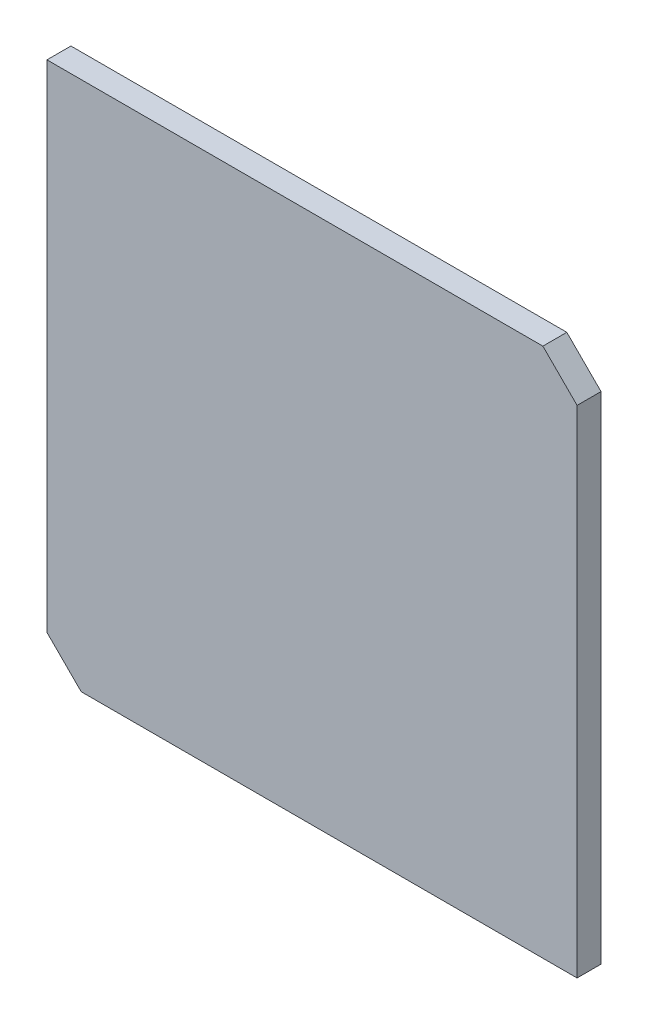
ISO-10303-21;
HEADER;
FILE_DESCRIPTION(('STEP AP214'),'2;1');
FILE_NAME('part.step','',(''),(''),'','','');
FILE_SCHEMA(('AUTOMOTIVE_DESIGN { 1 0 10303 214 1 1 1 1 }'));
ENDSEC;
DATA;
#1=APPLICATION_CONTEXT('core data for automotive mechanical design processes');
#2=APPLICATION_PROTOCOL_DEFINITION('international standard','automotive_design',2000,#1);
#3=PRODUCT_CONTEXT('',#1,'mechanical');
#4=PRODUCT('Part','Part','',(#3));
#5=PRODUCT_RELATED_PRODUCT_CATEGORY('part','',(#4));
#6=PRODUCT_DEFINITION_FORMATION('','',#4);
#7=PRODUCT_DEFINITION_CONTEXT('part definition',#1,'design');
#8=PRODUCT_DEFINITION('design','',#6,#7);
#9=PRODUCT_DEFINITION_SHAPE('','',#8);
#10=(LENGTH_UNIT() NAMED_UNIT(*) SI_UNIT(.MILLI.,.METRE.));
#11=(NAMED_UNIT(*) PLANE_ANGLE_UNIT() SI_UNIT($,.RADIAN.));
#12=(NAMED_UNIT(*) SI_UNIT($,.STERADIAN.) SOLID_ANGLE_UNIT());
#13=UNCERTAINTY_MEASURE_WITH_UNIT(LENGTH_MEASURE(1.E-05),#10,'distance_accuracy_value','');
#14=(GEOMETRIC_REPRESENTATION_CONTEXT(3) GLOBAL_UNCERTAINTY_ASSIGNED_CONTEXT((#13)) GLOBAL_UNIT_ASSIGNED_CONTEXT((#10,
#11,#12)) REPRESENTATION_CONTEXT('',''));
#15=CARTESIAN_POINT('',(0.,0.,0.));
#16=DIRECTION('',(0.,0.,1.));
#17=DIRECTION('',(1.,0.,0.));
#18=AXIS2_PLACEMENT_3D('',#15,#16,#17);
#19=CARTESIAN_POINT('',(-155.,155.,14.));
#20=DIRECTION('',(1.,0.,0.));
#21=DIRECTION('',(0.,1.,0.));
#22=AXIS2_PLACEMENT_3D('',#19,#20,#21);
#23=PLANE('',#22);
#24=DIRECTION('',(0.,-1.,0.));
#25=VECTOR('',#24,1.);
#26=CARTESIAN_POINT('',(-155.,155.,0.));
#27=LINE('',#26,#25);
#28=CARTESIAN_POINT('',(-155.,155.,0.));
#29=VERTEX_POINT('',#28);
#30=CARTESIAN_POINT('',(-155.,-135.,0.));
#31=VERTEX_POINT('',#30);
#32=EDGE_CURVE('E116',#29,#31,#27,.T.);
#33=ORIENTED_EDGE('',*,*,#32,.T.);
#34=DIRECTION('',(0.,0.,-1.));
#35=VECTOR('',#34,1.);
#36=CARTESIAN_POINT('',(-155.,-135.,14.));
#37=LINE('',#36,#35);
#38=CARTESIAN_POINT('',(-155.,-135.,14.));
#39=VERTEX_POINT('',#38);
#40=EDGE_CURVE('E11',#39,#31,#37,.T.);
#41=ORIENTED_EDGE('',*,*,#40,.F.);
#42=DIRECTION('',(0.,-1.,0.));
#43=VECTOR('',#42,1.);
#44=CARTESIAN_POINT('',(-155.,155.,14.));
#45=LINE('',#44,#43);
#46=CARTESIAN_POINT('',(-155.,155.,14.));
#47=VERTEX_POINT('',#46);
#48=EDGE_CURVE('E126',#47,#39,#45,.T.);
#49=ORIENTED_EDGE('',*,*,#48,.F.);
#50=DIRECTION('',(0.,0.,-1.));
#51=VECTOR('',#50,1.);
#52=CARTESIAN_POINT('',(-155.,155.,14.));
#53=LINE('',#52,#51);
#54=EDGE_CURVE('E112',#47,#29,#53,.T.);
#55=ORIENTED_EDGE('',*,*,#54,.T.);
#56=EDGE_LOOP('',(#33,#41,#49,#55));
#57=FACE_BOUND('',#56,.T.);
#58=ADVANCED_FACE('F32',(#57),#23,.F.);
#59=CARTESIAN_POINT('',(-155.,-135.,14.));
#60=DIRECTION('',(0.707106781186547,0.707106781186548,0.));
#61=DIRECTION('',(-0.707106781186548,0.707106781186547,0.));
#62=AXIS2_PLACEMENT_3D('',#59,#60,#61);
#63=PLANE('',#62);
#64=DIRECTION('',(0.707106781186548,-0.707106781186547,0.));
#65=VECTOR('',#64,1.);
#66=CARTESIAN_POINT('',(-155.,-135.,0.));
#67=LINE('',#66,#65);
#68=CARTESIAN_POINT('',(-135.,-155.,0.));
#69=VERTEX_POINT('',#68);
#70=EDGE_CURVE('E119',#31,#69,#67,.T.);
#71=ORIENTED_EDGE('',*,*,#70,.T.);
#72=DIRECTION('',(0.,0.,-1.));
#73=VECTOR('',#72,1.);
#74=CARTESIAN_POINT('',(-135.,-155.,14.));
#75=LINE('',#74,#73);
#76=CARTESIAN_POINT('',(-135.,-155.,14.));
#77=VERTEX_POINT('',#76);
#78=EDGE_CURVE('E40',#77,#69,#75,.T.);
#79=ORIENTED_EDGE('',*,*,#78,.F.);
#80=DIRECTION('',(0.707106781186548,-0.707106781186547,0.));
#81=VECTOR('',#80,1.);
#82=CARTESIAN_POINT('',(-155.,-135.,14.));
#83=LINE('',#82,#81);
#84=EDGE_CURVE('E85',#39,#77,#83,.T.);
#85=ORIENTED_EDGE('',*,*,#84,.F.);
#86=ORIENTED_EDGE('',*,*,#40,.T.);
#87=EDGE_LOOP('',(#71,#79,#85,#86));
#88=FACE_BOUND('',#87,.T.);
#89=ADVANCED_FACE('F150',(#88),#63,.F.);
#90=CARTESIAN_POINT('',(-135.,-155.,14.));
#91=DIRECTION('',(0.,1.,0.));
#92=DIRECTION('',(0.,0.,1.));
#93=AXIS2_PLACEMENT_3D('',#90,#91,#92);
#94=PLANE('',#93);
#95=DIRECTION('',(1.,0.,0.));
#96=VECTOR('',#95,1.);
#97=CARTESIAN_POINT('',(-135.,-155.,0.));
#98=LINE('',#97,#96);
#99=CARTESIAN_POINT('',(155.,-155.,0.));
#100=VERTEX_POINT('',#99);
#101=EDGE_CURVE('E121',#69,#100,#98,.T.);
#102=ORIENTED_EDGE('',*,*,#101,.T.);
#103=DIRECTION('',(0.,0.,-1.));
#104=VECTOR('',#103,1.);
#105=CARTESIAN_POINT('',(155.,-155.,14.));
#106=LINE('',#105,#104);
#107=CARTESIAN_POINT('',(155.,-155.,14.));
#108=VERTEX_POINT('',#107);
#109=EDGE_CURVE('E107',#108,#100,#106,.T.);
#110=ORIENTED_EDGE('',*,*,#109,.F.);
#111=DIRECTION('',(1.,0.,0.));
#112=VECTOR('',#111,1.);
#113=CARTESIAN_POINT('',(-135.,-155.,14.));
#114=LINE('',#113,#112);
#115=EDGE_CURVE('E98',#77,#108,#114,.T.);
#116=ORIENTED_EDGE('',*,*,#115,.F.);
#117=ORIENTED_EDGE('',*,*,#78,.T.);
#118=EDGE_LOOP('',(#102,#110,#116,#117));
#119=FACE_BOUND('',#118,.T.);
#120=ADVANCED_FACE('F132',(#119),#94,.F.);
#121=CARTESIAN_POINT('',(155.,135.,14.));
#122=DIRECTION('',(-1.,0.,0.));
#123=DIRECTION('',(0.,-1.,0.));
#124=AXIS2_PLACEMENT_3D('',#121,#122,#123);
#125=PLANE('',#124);
#126=DIRECTION('',(0.,1.,0.));
#127=VECTOR('',#126,1.);
#128=CARTESIAN_POINT('',(155.,135.,0.));
#129=LINE('',#128,#127);
#130=CARTESIAN_POINT('',(155.,135.,0.));
#131=VERTEX_POINT('',#130);
#132=EDGE_CURVE('E106',#100,#131,#129,.T.);
#133=ORIENTED_EDGE('',*,*,#132,.T.);
#134=DIRECTION('',(0.,0.,-1.));
#135=VECTOR('',#134,1.);
#136=CARTESIAN_POINT('',(155.,135.,14.));
#137=LINE('',#136,#135);
#138=CARTESIAN_POINT('',(155.,135.,14.));
#139=VERTEX_POINT('',#138);
#140=EDGE_CURVE('E103',#139,#131,#137,.T.);
#141=ORIENTED_EDGE('',*,*,#140,.F.);
#142=DIRECTION('',(0.,1.,0.));
#143=VECTOR('',#142,1.);
#144=CARTESIAN_POINT('',(155.,135.,14.));
#145=LINE('',#144,#143);
#146=EDGE_CURVE('E92',#108,#139,#145,.T.);
#147=ORIENTED_EDGE('',*,*,#146,.F.);
#148=ORIENTED_EDGE('',*,*,#109,.T.);
#149=EDGE_LOOP('',(#133,#141,#147,#148));
#150=FACE_BOUND('',#149,.T.);
#151=ADVANCED_FACE('F104',(#150),#125,.F.);
#152=CARTESIAN_POINT('',(135.,155.,14.));
#153=DIRECTION('',(-0.707106781186548,-0.707106781186548,0.));
#154=DIRECTION('',(0.707106781186548,-0.707106781186548,0.));
#155=AXIS2_PLACEMENT_3D('',#152,#153,#154);
#156=PLANE('',#155);
#157=DIRECTION('',(-0.707106781186547,0.707106781186547,0.));
#158=VECTOR('',#157,1.);
#159=CARTESIAN_POINT('',(135.,155.,0.));
#160=LINE('',#159,#158);
#161=CARTESIAN_POINT('',(135.,155.,0.));
#162=VERTEX_POINT('',#161);
#163=EDGE_CURVE('E71',#131,#162,#160,.T.);
#164=ORIENTED_EDGE('',*,*,#163,.T.);
#165=DIRECTION('',(0.,0.,-1.));
#166=VECTOR('',#165,1.);
#167=CARTESIAN_POINT('',(135.,155.,14.));
#168=LINE('',#167,#166);
#169=CARTESIAN_POINT('',(135.,155.,14.));
#170=VERTEX_POINT('',#169);
#171=EDGE_CURVE('E108',#170,#162,#168,.T.);
#172=ORIENTED_EDGE('',*,*,#171,.F.);
#173=DIRECTION('',(-0.707106781186547,0.707106781186547,0.));
#174=VECTOR('',#173,1.);
#175=CARTESIAN_POINT('',(135.,155.,14.));
#176=LINE('',#175,#174);
#177=EDGE_CURVE('E96',#139,#170,#176,.T.);
#178=ORIENTED_EDGE('',*,*,#177,.F.);
#179=ORIENTED_EDGE('',*,*,#140,.T.);
#180=EDGE_LOOP('',(#164,#172,#178,#179));
#181=FACE_BOUND('',#180,.T.);
#182=ADVANCED_FACE('F110',(#181),#156,.F.);
#183=CARTESIAN_POINT('',(-155.,155.,14.));
#184=DIRECTION('',(0.,-1.,0.));
#185=DIRECTION('',(1.,0.,0.));
#186=AXIS2_PLACEMENT_3D('',#183,#184,#185);
#187=PLANE('',#186);
#188=DIRECTION('',(-1.,0.,0.));
#189=VECTOR('',#188,1.);
#190=CARTESIAN_POINT('',(-155.,155.,0.));
#191=LINE('',#190,#189);
#192=EDGE_CURVE('E77',#162,#29,#191,.T.);
#193=ORIENTED_EDGE('',*,*,#192,.T.);
#194=ORIENTED_EDGE('',*,*,#54,.F.);
#195=DIRECTION('',(-1.,0.,0.));
#196=VECTOR('',#195,1.);
#197=CARTESIAN_POINT('',(-155.,155.,14.));
#198=LINE('',#197,#196);
#199=EDGE_CURVE('E48',#170,#47,#198,.T.);
#200=ORIENTED_EDGE('',*,*,#199,.F.);
#201=ORIENTED_EDGE('',*,*,#171,.T.);
#202=EDGE_LOOP('',(#193,#194,#200,#201));
#203=FACE_BOUND('',#202,.T.);
#204=ADVANCED_FACE('F139',(#203),#187,.F.);
#205=CARTESIAN_POINT('',(-155.,155.,14.));
#206=DIRECTION('',(0.,0.,1.));
#207=DIRECTION('',(1.,0.,0.));
#208=AXIS2_PLACEMENT_3D('',#205,#206,#207);
#209=PLANE('',#208);
#210=ORIENTED_EDGE('',*,*,#48,.T.);
#211=ORIENTED_EDGE('',*,*,#84,.T.);
#212=ORIENTED_EDGE('',*,*,#115,.T.);
#213=ORIENTED_EDGE('',*,*,#146,.T.);
#214=ORIENTED_EDGE('',*,*,#177,.T.);
#215=ORIENTED_EDGE('',*,*,#199,.T.);
#216=EDGE_LOOP('',(#210,#211,#212,#213,#214,#215));
#217=FACE_BOUND('',#216,.T.);
#218=ADVANCED_FACE('F94',(#217),#209,.T.);
#219=CARTESIAN_POINT('',(-155.,155.,0.));
#220=DIRECTION('',(0.,0.,1.));
#221=DIRECTION('',(1.,0.,0.));
#222=AXIS2_PLACEMENT_3D('',#219,#220,#221);
#223=PLANE('',#222);
#224=ORIENTED_EDGE('',*,*,#32,.F.);
#225=ORIENTED_EDGE('',*,*,#192,.F.);
#226=ORIENTED_EDGE('',*,*,#163,.F.);
#227=ORIENTED_EDGE('',*,*,#132,.F.);
#228=ORIENTED_EDGE('',*,*,#101,.F.);
#229=ORIENTED_EDGE('',*,*,#70,.F.);
#230=EDGE_LOOP('',(#224,#225,#226,#227,#228,#229));
#231=FACE_BOUND('',#230,.T.);
#232=ADVANCED_FACE('F135',(#231),#223,.F.);
#233=CLOSED_SHELL('',(#58,#89,#120,#151,#182,#204,#218,#232));
#234=MANIFOLD_SOLID_BREP('B2',#233);
#235=ADVANCED_BREP_SHAPE_REPRESENTATION('',(#18,#234),#14);
#236=SHAPE_DEFINITION_REPRESENTATION(#9,#235);
ENDSEC;
END-ISO-10303-21;
